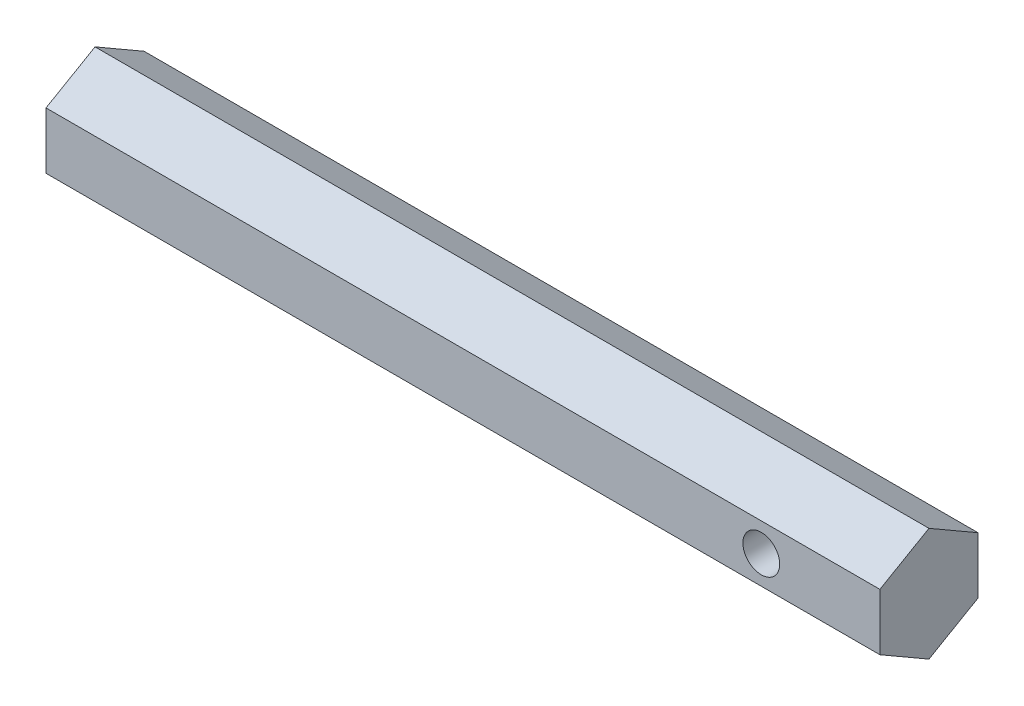
ISO-10303-21;
HEADER;
FILE_DESCRIPTION(('STEP AP214'),'2;1');
FILE_NAME('part.step','',(''),(''),'','','');
FILE_SCHEMA(('AUTOMOTIVE_DESIGN { 1 0 10303 214 1 1 1 1 }'));
ENDSEC;
DATA;
#1=APPLICATION_CONTEXT('core data for automotive mechanical design processes');
#2=APPLICATION_PROTOCOL_DEFINITION('international standard','automotive_design',2000,#1);
#3=PRODUCT_CONTEXT('',#1,'mechanical');
#4=PRODUCT('Part','Part','',(#3));
#5=PRODUCT_RELATED_PRODUCT_CATEGORY('part','',(#4));
#6=PRODUCT_DEFINITION_FORMATION('','',#4);
#7=PRODUCT_DEFINITION_CONTEXT('part definition',#1,'design');
#8=PRODUCT_DEFINITION('design','',#6,#7);
#9=PRODUCT_DEFINITION_SHAPE('','',#8);
#10=(LENGTH_UNIT() NAMED_UNIT(*) SI_UNIT(.MILLI.,.METRE.));
#11=(NAMED_UNIT(*) PLANE_ANGLE_UNIT() SI_UNIT($,.RADIAN.));
#12=(NAMED_UNIT(*) SI_UNIT($,.STERADIAN.) SOLID_ANGLE_UNIT());
#13=UNCERTAINTY_MEASURE_WITH_UNIT(LENGTH_MEASURE(1.E-05),#10,'distance_accuracy_value','');
#14=(GEOMETRIC_REPRESENTATION_CONTEXT(3) GLOBAL_UNCERTAINTY_ASSIGNED_CONTEXT((#13)) GLOBAL_UNIT_ASSIGNED_CONTEXT((#10,
#11,#12)) REPRESENTATION_CONTEXT('',''));
#15=CARTESIAN_POINT('',(0.,0.,0.));
#16=DIRECTION('',(0.,0.,1.));
#17=DIRECTION('',(1.,0.,0.));
#18=AXIS2_PLACEMENT_3D('',#15,#16,#17);
#19=CARTESIAN_POINT('',(107.95,-7.33234841870825,0.));
#20=DIRECTION('',(0.,0.866025403784438,0.5));
#21=DIRECTION('',(0.,-0.5,0.866025403784439));
#22=AXIS2_PLACEMENT_3D('',#19,#20,#21);
#23=PLANE('',#22);
#24=DIRECTION('',(0.,0.5,-0.866025403784438));
#25=VECTOR('',#24,1.);
#26=CARTESIAN_POINT('',(0.,-7.33234841870825,0.));
#27=LINE('',#26,#25);
#28=CARTESIAN_POINT('',(0.,-7.33234841870825,0.));
#29=VERTEX_POINT('',#28);
#30=CARTESIAN_POINT('',(0.,-3.66617420935412,-6.35));
#31=VERTEX_POINT('',#30);
#32=EDGE_CURVE('E123',#29,#31,#27,.T.);
#33=ORIENTED_EDGE('',*,*,#32,.T.);
#34=DIRECTION('',(-1.,0.,0.));
#35=VECTOR('',#34,1.);
#36=CARTESIAN_POINT('',(107.95,-3.66617420935412,-6.35));
#37=LINE('',#36,#35);
#38=CARTESIAN_POINT('',(107.95,-3.66617420935412,-6.35));
#39=VERTEX_POINT('',#38);
#40=EDGE_CURVE('E11',#39,#31,#37,.T.);
#41=ORIENTED_EDGE('',*,*,#40,.F.);
#42=DIRECTION('',(0.,0.5,-0.866025403784438));
#43=VECTOR('',#42,1.);
#44=CARTESIAN_POINT('',(107.95,-7.33234841870825,0.));
#45=LINE('',#44,#43);
#46=CARTESIAN_POINT('',(107.95,-7.33234841870825,0.));
#47=VERTEX_POINT('',#46);
#48=EDGE_CURVE('E134',#47,#39,#45,.T.);
#49=ORIENTED_EDGE('',*,*,#48,.F.);
#50=DIRECTION('',(-1.,0.,0.));
#51=VECTOR('',#50,1.);
#52=CARTESIAN_POINT('',(107.95,-7.33234841870825,0.));
#53=LINE('',#52,#51);
#54=EDGE_CURVE('E119',#47,#29,#53,.T.);
#55=ORIENTED_EDGE('',*,*,#54,.T.);
#56=EDGE_LOOP('',(#33,#41,#49,#55));
#57=FACE_BOUND('',#56,.T.);
#58=ADVANCED_FACE('F39',(#57),#23,.F.);
#59=CARTESIAN_POINT('',(107.95,-3.66617420935412,-6.35));
#60=DIRECTION('',(0.,0.,1.));
#61=DIRECTION('',(1.,0.,0.));
#62=AXIS2_PLACEMENT_3D('',#59,#60,#61);
#63=PLANE('',#62);
#64=CARTESIAN_POINT('',(92.5968176,0.,-6.35));
#65=DIRECTION('',(0.,0.,1.));
#66=DIRECTION('',(1.,0.,0.));
#67=AXIS2_PLACEMENT_3D('',#64,#65,#66);
#68=CIRCLE('',#67,2.38125000000001);
#69=CARTESIAN_POINT('',(94.9780676,0.,-6.35));
#70=VERTEX_POINT('',#69);
#71=EDGE_CURVE('E127',#70,#70,#68,.T.);
#72=ORIENTED_EDGE('',*,*,#71,.T.);
#73=EDGE_LOOP('',(#72));
#74=FACE_BOUND('',#73,.T.);
#75=DIRECTION('',(0.,1.,0.));
#76=VECTOR('',#75,1.);
#77=CARTESIAN_POINT('',(0.,-3.66617420935412,-6.35));
#78=LINE('',#77,#76);
#79=CARTESIAN_POINT('',(0.,3.66617420935412,-6.35));
#80=VERTEX_POINT('',#79);
#81=EDGE_CURVE('E126',#31,#80,#78,.T.);
#82=ORIENTED_EDGE('',*,*,#81,.T.);
#83=DIRECTION('',(-1.,0.,0.));
#84=VECTOR('',#83,1.);
#85=CARTESIAN_POINT('',(107.95,3.66617420935412,-6.35));
#86=LINE('',#85,#84);
#87=CARTESIAN_POINT('',(107.95,3.66617420935412,-6.35));
#88=VERTEX_POINT('',#87);
#89=EDGE_CURVE('E47',#88,#80,#86,.T.);
#90=ORIENTED_EDGE('',*,*,#89,.F.);
#91=DIRECTION('',(0.,1.,0.));
#92=VECTOR('',#91,1.);
#93=CARTESIAN_POINT('',(107.95,-3.66617420935412,-6.35));
#94=LINE('',#93,#92);
#95=EDGE_CURVE('E92',#39,#88,#94,.T.);
#96=ORIENTED_EDGE('',*,*,#95,.F.);
#97=ORIENTED_EDGE('',*,*,#40,.T.);
#98=EDGE_LOOP('',(#82,#90,#96,#97));
#99=FACE_BOUND('',#98,.T.);
#100=ADVANCED_FACE('F159',(#74,#99),#63,.F.);
#101=CARTESIAN_POINT('',(107.95,3.66617420935412,-6.35));
#102=DIRECTION('',(0.,-0.866025403784439,0.5));
#103=DIRECTION('',(0.,-0.5,-0.866025403784439));
#104=AXIS2_PLACEMENT_3D('',#101,#102,#103);
#105=PLANE('',#104);
#106=DIRECTION('',(0.,0.5,0.866025403784439));
#107=VECTOR('',#106,1.);
#108=CARTESIAN_POINT('',(0.,3.66617420935412,-6.35));
#109=LINE('',#108,#107);
#110=CARTESIAN_POINT('',(0.,7.33234841870825,0.));
#111=VERTEX_POINT('',#110);
#112=EDGE_CURVE('E129',#80,#111,#109,.T.);
#113=ORIENTED_EDGE('',*,*,#112,.T.);
#114=DIRECTION('',(-1.,0.,0.));
#115=VECTOR('',#114,1.);
#116=CARTESIAN_POINT('',(107.95,7.33234841870825,0.));
#117=LINE('',#116,#115);
#118=CARTESIAN_POINT('',(107.95,7.33234841870825,0.));
#119=VERTEX_POINT('',#118);
#120=EDGE_CURVE('E114',#119,#111,#117,.T.);
#121=ORIENTED_EDGE('',*,*,#120,.F.);
#122=DIRECTION('',(0.,0.5,0.866025403784439));
#123=VECTOR('',#122,1.);
#124=CARTESIAN_POINT('',(107.95,3.66617420935412,-6.35));
#125=LINE('',#124,#123);
#126=EDGE_CURVE('E105',#88,#119,#125,.T.);
#127=ORIENTED_EDGE('',*,*,#126,.F.);
#128=ORIENTED_EDGE('',*,*,#89,.T.);
#129=EDGE_LOOP('',(#113,#121,#127,#128));
#130=FACE_BOUND('',#129,.T.);
#131=ADVANCED_FACE('F140',(#130),#105,.F.);
#132=CARTESIAN_POINT('',(107.95,7.33234841870825,0.));
#133=DIRECTION('',(0.,-0.866025403784438,-0.5));
#134=DIRECTION('',(0.,0.5,-0.866025403784439));
#135=AXIS2_PLACEMENT_3D('',#132,#133,#134);
#136=PLANE('',#135);
#137=DIRECTION('',(0.,-0.5,0.866025403784438));
#138=VECTOR('',#137,1.);
#139=CARTESIAN_POINT('',(0.,7.33234841870825,0.));
#140=LINE('',#139,#138);
#141=CARTESIAN_POINT('',(0.,3.66617420935412,6.35));
#142=VERTEX_POINT('',#141);
#143=EDGE_CURVE('E113',#111,#142,#140,.T.);
#144=ORIENTED_EDGE('',*,*,#143,.T.);
#145=DIRECTION('',(-1.,0.,0.));
#146=VECTOR('',#145,1.);
#147=CARTESIAN_POINT('',(107.95,3.66617420935412,6.35));
#148=LINE('',#147,#146);
#149=CARTESIAN_POINT('',(107.95,3.66617420935412,6.35));
#150=VERTEX_POINT('',#149);
#151=EDGE_CURVE('E110',#150,#142,#148,.T.);
#152=ORIENTED_EDGE('',*,*,#151,.F.);
#153=DIRECTION('',(0.,-0.5,0.866025403784438));
#154=VECTOR('',#153,1.);
#155=CARTESIAN_POINT('',(107.95,7.33234841870825,0.));
#156=LINE('',#155,#154);
#157=EDGE_CURVE('E99',#119,#150,#156,.T.);
#158=ORIENTED_EDGE('',*,*,#157,.F.);
#159=ORIENTED_EDGE('',*,*,#120,.T.);
#160=EDGE_LOOP('',(#144,#152,#158,#159));
#161=FACE_BOUND('',#160,.T.);
#162=ADVANCED_FACE('F111',(#161),#136,.F.);
#163=CARTESIAN_POINT('',(107.95,3.66617420935412,6.35));
#164=DIRECTION('',(0.,0.,-1.));
#165=DIRECTION('',(0.,1.,0.));
#166=AXIS2_PLACEMENT_3D('',#163,#164,#165);
#167=PLANE('',#166);
#168=CARTESIAN_POINT('',(92.5968176,0.,6.35));
#169=DIRECTION('',(0.,0.,1.));
#170=DIRECTION('',(1.,0.,0.));
#171=AXIS2_PLACEMENT_3D('',#168,#169,#170);
#172=CIRCLE('',#171,2.38125000000001);
#173=CARTESIAN_POINT('',(94.9780676,0.,6.35));
#174=VERTEX_POINT('',#173);
#175=EDGE_CURVE('E246',#174,#174,#172,.T.);
#176=ORIENTED_EDGE('',*,*,#175,.F.);
#177=EDGE_LOOP('',(#176));
#178=FACE_BOUND('',#177,.T.);
#179=DIRECTION('',(0.,-1.,0.));
#180=VECTOR('',#179,1.);
#181=CARTESIAN_POINT('',(0.,3.66617420935412,6.35));
#182=LINE('',#181,#180);
#183=CARTESIAN_POINT('',(0.,-3.66617420935412,6.35));
#184=VERTEX_POINT('',#183);
#185=EDGE_CURVE('E78',#142,#184,#182,.T.);
#186=ORIENTED_EDGE('',*,*,#185,.T.);
#187=DIRECTION('',(-1.,0.,0.));
#188=VECTOR('',#187,1.);
#189=CARTESIAN_POINT('',(107.95,-3.66617420935412,6.35));
#190=LINE('',#189,#188);
#191=CARTESIAN_POINT('',(107.95,-3.66617420935412,6.35));
#192=VERTEX_POINT('',#191);
#193=EDGE_CURVE('E115',#192,#184,#190,.T.);
#194=ORIENTED_EDGE('',*,*,#193,.F.);
#195=DIRECTION('',(0.,-1.,0.));
#196=VECTOR('',#195,1.);
#197=CARTESIAN_POINT('',(107.95,3.66617420935412,6.35));
#198=LINE('',#197,#196);
#199=EDGE_CURVE('E103',#150,#192,#198,.T.);
#200=ORIENTED_EDGE('',*,*,#199,.F.);
#201=ORIENTED_EDGE('',*,*,#151,.T.);
#202=EDGE_LOOP('',(#186,#194,#200,#201));
#203=FACE_BOUND('',#202,.T.);
#204=ADVANCED_FACE('F117',(#178,#203),#167,.F.);
#205=CARTESIAN_POINT('',(107.95,-3.66617420935412,6.35));
#206=DIRECTION('',(0.,0.866025403784439,-0.5));
#207=DIRECTION('',(0.,0.5,0.866025403784439));
#208=AXIS2_PLACEMENT_3D('',#205,#206,#207);
#209=PLANE('',#208);
#210=DIRECTION('',(0.,-0.5,-0.866025403784439));
#211=VECTOR('',#210,1.);
#212=CARTESIAN_POINT('',(0.,-3.66617420935412,6.35));
#213=LINE('',#212,#211);
#214=EDGE_CURVE('E84',#184,#29,#213,.T.);
#215=ORIENTED_EDGE('',*,*,#214,.T.);
#216=ORIENTED_EDGE('',*,*,#54,.F.);
#217=DIRECTION('',(0.,-0.5,-0.866025403784439));
#218=VECTOR('',#217,1.);
#219=CARTESIAN_POINT('',(107.95,-3.66617420935412,6.35));
#220=LINE('',#219,#218);
#221=EDGE_CURVE('E55',#192,#47,#220,.T.);
#222=ORIENTED_EDGE('',*,*,#221,.F.);
#223=ORIENTED_EDGE('',*,*,#193,.T.);
#224=EDGE_LOOP('',(#215,#216,#222,#223));
#225=FACE_BOUND('',#224,.T.);
#226=ADVANCED_FACE('F147',(#225),#209,.F.);
#227=CARTESIAN_POINT('',(107.95,0.,0.));
#228=DIRECTION('',(1.,0.,0.));
#229=DIRECTION('',(0.,0.,-1.));
#230=AXIS2_PLACEMENT_3D('',#227,#228,#229);
#231=PLANE('',#230);
#232=ORIENTED_EDGE('',*,*,#48,.T.);
#233=ORIENTED_EDGE('',*,*,#95,.T.);
#234=ORIENTED_EDGE('',*,*,#126,.T.);
#235=ORIENTED_EDGE('',*,*,#157,.T.);
#236=ORIENTED_EDGE('',*,*,#199,.T.);
#237=ORIENTED_EDGE('',*,*,#221,.T.);
#238=EDGE_LOOP('',(#232,#233,#234,#235,#236,#237));
#239=FACE_BOUND('',#238,.T.);
#240=ADVANCED_FACE('F101',(#239),#231,.T.);
#241=CARTESIAN_POINT('',(0.,0.,0.));
#242=DIRECTION('',(1.,0.,0.));
#243=DIRECTION('',(0.,0.,-1.));
#244=AXIS2_PLACEMENT_3D('',#241,#242,#243);
#245=PLANE('',#244);
#246=ORIENTED_EDGE('',*,*,#32,.F.);
#247=ORIENTED_EDGE('',*,*,#214,.F.);
#248=ORIENTED_EDGE('',*,*,#185,.F.);
#249=ORIENTED_EDGE('',*,*,#143,.F.);
#250=ORIENTED_EDGE('',*,*,#112,.F.);
#251=ORIENTED_EDGE('',*,*,#81,.F.);
#252=EDGE_LOOP('',(#246,#247,#248,#249,#250,#251));
#253=FACE_BOUND('',#252,.T.);
#254=ADVANCED_FACE('F143',(#253),#245,.F.);
#255=CARTESIAN_POINT('',(92.5968176,0.,-6.35));
#256=DIRECTION('',(0.,0.,1.));
#257=DIRECTION('',(1.,0.,0.));
#258=AXIS2_PLACEMENT_3D('',#255,#256,#257);
#259=CYLINDRICAL_SURFACE('',#258,2.38125000000001);
#260=CARTESIAN_POINT('',(94.9780676,0.,-6.35));
#261=CARTESIAN_POINT('',(94.9780676,0.,-6.21770833333334));
#262=CARTESIAN_POINT('',(94.9780676,0.,-6.08541666666667));
#263=CARTESIAN_POINT('',(94.9780676,0.,-5.82083333333333));
#264=CARTESIAN_POINT('',(94.9780676,0.,-5.68854166666667));
#265=CARTESIAN_POINT('',(94.9780676,0.,-5.42395833333333));
#266=CARTESIAN_POINT('',(94.9780676,0.,-5.29166666666667));
#267=CARTESIAN_POINT('',(94.9780676,0.,-5.02708333333333));
#268=CARTESIAN_POINT('',(94.9780676,0.,-4.89479166666667));
#269=CARTESIAN_POINT('',(94.9780676,0.,-4.63020833333333));
#270=CARTESIAN_POINT('',(94.9780676,0.,-4.49791666666667));
#271=CARTESIAN_POINT('',(94.9780676,0.,-4.23333333333333));
#272=CARTESIAN_POINT('',(94.9780676,0.,-4.10104166666667));
#273=CARTESIAN_POINT('',(94.9780676,0.,-3.83645833333334));
#274=CARTESIAN_POINT('',(94.9780676,0.,-3.70416666666667));
#275=CARTESIAN_POINT('',(94.9780676,0.,-3.43958333333333));
#276=CARTESIAN_POINT('',(94.9780676,0.,-3.30729166666667));
#277=CARTESIAN_POINT('',(94.9780676,0.,-3.04270833333333));
#278=CARTESIAN_POINT('',(94.9780676,0.,-2.91041666666667));
#279=CARTESIAN_POINT('',(94.9780676,0.,-2.64583333333334));
#280=CARTESIAN_POINT('',(94.9780676,0.,-2.51354166666667));
#281=CARTESIAN_POINT('',(94.9780676,0.,-2.24895833333334));
#282=CARTESIAN_POINT('',(94.9780676,0.,-2.11666666666667));
#283=CARTESIAN_POINT('',(94.9780676,0.,-1.85208333333334));
#284=CARTESIAN_POINT('',(94.9780676,0.,-1.71979166666667));
#285=CARTESIAN_POINT('',(94.9780676,0.,-1.45520833333334));
#286=CARTESIAN_POINT('',(94.9780676,0.,-1.32291666666667));
#287=CARTESIAN_POINT('',(94.9780676,0.,-1.05833333333334));
#288=CARTESIAN_POINT('',(94.9780676,0.,-0.926041666666669));
#289=CARTESIAN_POINT('',(94.9780676,0.,-0.661458333333335));
#290=CARTESIAN_POINT('',(94.9780676,0.,-0.529166666666668));
#291=CARTESIAN_POINT('',(94.9780676,0.,-0.264583333333335));
#292=CARTESIAN_POINT('',(94.9780676,0.,-0.132291666666668));
#293=CARTESIAN_POINT('',(94.9780676,0.,0.132291666666665));
#294=CARTESIAN_POINT('',(94.9780676,0.,0.264583333333331));
#295=CARTESIAN_POINT('',(94.9780676,0.,0.529166666666665));
#296=CARTESIAN_POINT('',(94.9780676,0.,0.661458333333332));
#297=CARTESIAN_POINT('',(94.9780676,0.,0.926041666666665));
#298=CARTESIAN_POINT('',(94.9780676,0.,1.05833333333333));
#299=CARTESIAN_POINT('',(94.9780676,0.,1.32291666666667));
#300=CARTESIAN_POINT('',(94.9780676,0.,1.45520833333333));
#301=CARTESIAN_POINT('',(94.9780676,0.,1.71979166666667));
#302=CARTESIAN_POINT('',(94.9780676,0.,1.85208333333333));
#303=CARTESIAN_POINT('',(94.9780676,0.,2.11666666666667));
#304=CARTESIAN_POINT('',(94.9780676,0.,2.24895833333333));
#305=CARTESIAN_POINT('',(94.9780676,0.,2.51354166666667));
#306=CARTESIAN_POINT('',(94.9780676,0.,2.64583333333333));
#307=CARTESIAN_POINT('',(94.9780676,0.,2.91041666666667));
#308=CARTESIAN_POINT('',(94.9780676,0.,3.04270833333333));
#309=CARTESIAN_POINT('',(94.9780676,0.,3.30729166666667));
#310=CARTESIAN_POINT('',(94.9780676,0.,3.43958333333333));
#311=CARTESIAN_POINT('',(94.9780676,0.,3.70416666666667));
#312=CARTESIAN_POINT('',(94.9780676,0.,3.83645833333333));
#313=CARTESIAN_POINT('',(94.9780676,0.,4.10104166666667));
#314=CARTESIAN_POINT('',(94.9780676,0.,4.23333333333333));
#315=CARTESIAN_POINT('',(94.9780676,0.,4.49791666666667));
#316=CARTESIAN_POINT('',(94.9780676,0.,4.63020833333333));
#317=CARTESIAN_POINT('',(94.9780676,0.,4.89479166666667));
#318=CARTESIAN_POINT('',(94.9780676,0.,5.02708333333333));
#319=CARTESIAN_POINT('',(94.9780676,0.,5.29166666666667));
#320=CARTESIAN_POINT('',(94.9780676,0.,5.42395833333333));
#321=CARTESIAN_POINT('',(94.9780676,0.,5.68854166666667));
#322=CARTESIAN_POINT('',(94.9780676,0.,5.82083333333333));
#323=CARTESIAN_POINT('',(94.9780676,0.,6.08541666666667));
#324=CARTESIAN_POINT('',(94.9780676,0.,6.21770833333333));
#325=CARTESIAN_POINT('',(94.9780676,0.,6.35));
#326=B_SPLINE_CURVE_WITH_KNOTS('',3,(#260,#261,#262,#263,#264,#265,#266,#267,#268,#269,#270,
#271,#272,#273,#274,#275,#276,#277,#278,#279,#280,#281,#282,#283,#284,#285,#286,#287,#288,#289,
#290,#291,#292,#293,#294,#295,#296,#297,#298,#299,#300,#301,#302,#303,#304,#305,#306,#307,#308,
#309,#310,#311,#312,#313,#314,#315,#316,#317,#318,#319,#320,#321,#322,#323,#324,#325),
.UNSPECIFIED.,.F.,.F.,(4,2,2,2,2,2,2,2,2,2,2,2,2,2,2,2,2,2,2,2,2,2,2,2,2,2,2,2,2,2,2,2,4),(0.,
0.396875000000001,0.79375,1.190625,1.5875,1.984375,2.38125,2.778125,3.175,3.571875,3.96875,
4.365625,4.7625,5.159375,5.55625,5.953125,6.35,6.746875,7.14375,7.540625,7.9375,8.334375,
8.73125,9.128125,9.525,9.921875,10.31875,10.715625,11.1125,11.509375,11.90625,12.303125,12.7),.UNSPECIFIED.);
#327=EDGE_CURVE('BSEAM189',#70,#174,#326,.T.);
#328=ORIENTED_EDGE('',*,*,#71,.F.);
#329=ORIENTED_EDGE('',*,*,#175,.T.);
#330=ORIENTED_EDGE('',*,*,#327,.T.);
#331=ORIENTED_EDGE('',*,*,#327,.F.);
#332=EDGE_LOOP('',(#328,#330,#329,#331));
#333=FACE_BOUND('',#332,.T.);
#334=ADVANCED_FACE('F189',(#333),#259,.F.);
#335=CLOSED_SHELL('',(#58,#100,#131,#162,#204,#226,#240,#254,#334));
#336=MANIFOLD_SOLID_BREP('B2',#335);
#337=ADVANCED_BREP_SHAPE_REPRESENTATION('',(#18,#336),#14);
#338=SHAPE_DEFINITION_REPRESENTATION(#9,#337);
ENDSEC;
END-ISO-10303-21;
